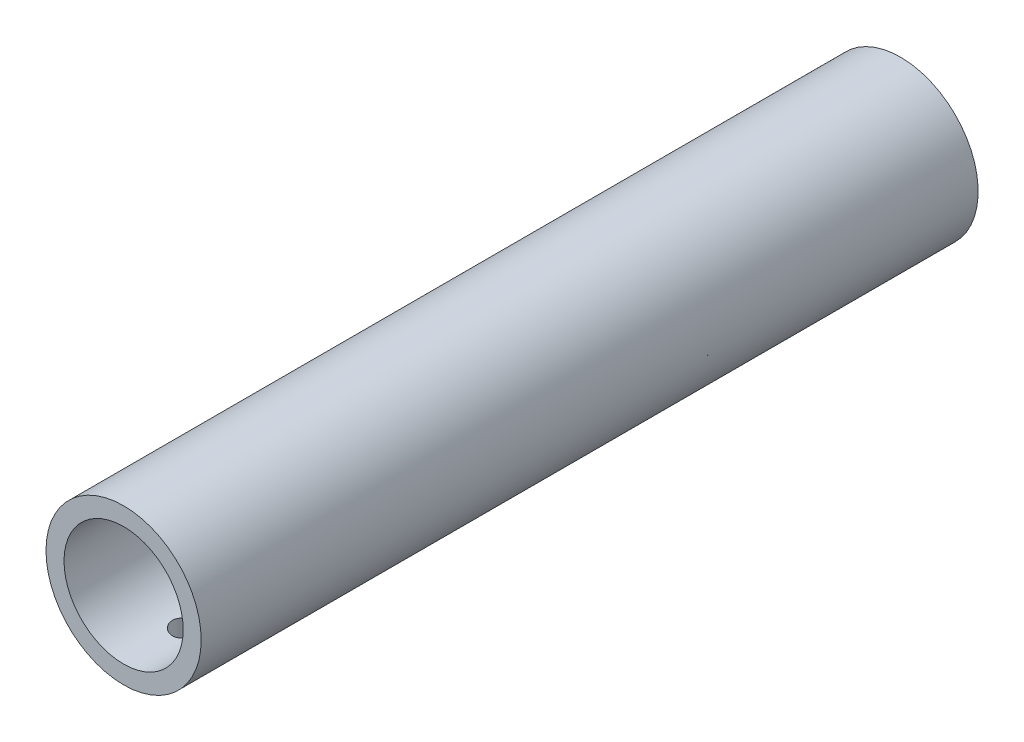
ISO-10303-21;
HEADER;
FILE_DESCRIPTION(('STEP AP214'),'2;1');
FILE_NAME('part.step','',(''),(''),'','','');
FILE_SCHEMA(('AUTOMOTIVE_DESIGN { 1 0 10303 214 1 1 1 1 }'));
ENDSEC;
DATA;
#1=APPLICATION_CONTEXT('core data for automotive mechanical design processes');
#2=APPLICATION_PROTOCOL_DEFINITION('international standard','automotive_design',2000,#1);
#3=PRODUCT_CONTEXT('',#1,'mechanical');
#4=PRODUCT('Part','Part','',(#3));
#5=PRODUCT_RELATED_PRODUCT_CATEGORY('part','',(#4));
#6=PRODUCT_DEFINITION_FORMATION('','',#4);
#7=PRODUCT_DEFINITION_CONTEXT('part definition',#1,'design');
#8=PRODUCT_DEFINITION('design','',#6,#7);
#9=PRODUCT_DEFINITION_SHAPE('','',#8);
#10=(LENGTH_UNIT() NAMED_UNIT(*) SI_UNIT(.MILLI.,.METRE.));
#11=(NAMED_UNIT(*) PLANE_ANGLE_UNIT() SI_UNIT($,.RADIAN.));
#12=(NAMED_UNIT(*) SI_UNIT($,.STERADIAN.) SOLID_ANGLE_UNIT());
#13=UNCERTAINTY_MEASURE_WITH_UNIT(LENGTH_MEASURE(1.E-05),#10,'distance_accuracy_value','');
#14=(GEOMETRIC_REPRESENTATION_CONTEXT(3) GLOBAL_UNCERTAINTY_ASSIGNED_CONTEXT((#13)) GLOBAL_UNIT_ASSIGNED_CONTEXT((#10,
#11,#12)) REPRESENTATION_CONTEXT('',''));
#15=CARTESIAN_POINT('',(0.,0.,0.));
#16=DIRECTION('',(0.,0.,1.));
#17=DIRECTION('',(1.,0.,0.));
#18=AXIS2_PLACEMENT_3D('',#15,#16,#17);
#19=CARTESIAN_POINT('',(0.,0.,123.));
#20=DIRECTION('',(0.,0.,1.));
#21=DIRECTION('',(1.,0.,0.));
#22=AXIS2_PLACEMENT_3D('',#19,#20,#21);
#23=PLANE('',#22);
#24=CARTESIAN_POINT('',(0.,0.,123.));
#25=DIRECTION('',(0.,0.,1.));
#26=DIRECTION('',(1.,0.,0.));
#27=AXIS2_PLACEMENT_3D('',#24,#25,#26);
#28=CIRCLE('',#27,12.7);
#29=CARTESIAN_POINT('',(12.7,0.,123.));
#30=VERTEX_POINT('',#29);
#31=EDGE_CURVE('E10',#30,#30,#28,.T.);
#32=ORIENTED_EDGE('',*,*,#31,.T.);
#33=EDGE_LOOP('',(#32));
#34=FACE_BOUND('',#33,.T.);
#35=CARTESIAN_POINT('',(0.,0.,123.));
#36=DIRECTION('',(0.,0.,1.));
#37=DIRECTION('',(1.,0.,0.));
#38=AXIS2_PLACEMENT_3D('',#35,#36,#37);
#39=CIRCLE('',#38,9.75);
#40=CARTESIAN_POINT('',(9.75,0.,123.));
#41=VERTEX_POINT('',#40);
#42=EDGE_CURVE('E51',#41,#41,#39,.T.);
#43=ORIENTED_EDGE('',*,*,#42,.F.);
#44=EDGE_LOOP('',(#43));
#45=FACE_BOUND('',#44,.T.);
#46=ADVANCED_FACE('F37',(#34,#45),#23,.T.);
#47=CARTESIAN_POINT('',(0.,0.,123.));
#48=DIRECTION('',(0.,0.,-1.));
#49=DIRECTION('',(-1.,0.,0.));
#50=AXIS2_PLACEMENT_3D('',#47,#48,#49);
#51=CYLINDRICAL_SURFACE('',#50,12.7);
#52=CARTESIAN_POINT('',(0.,-12.7,11.67));
#53=CARTESIAN_POINT('',(0.0839420822698033,-12.6999988827326,11.6699964118079));
#54=CARTESIAN_POINT('',(0.167937526372633,-12.6991589575206,11.6629299789214));
#55=CARTESIAN_POINT('',(0.333593673959524,-12.6958891128375,11.6348506887906));
#56=CARTESIAN_POINT('',(0.415251803532516,-12.6934575059403,11.6138230301719));
#57=CARTESIAN_POINT('',(0.573810929266175,-12.6872783957521,11.5584472459305));
#58=CARTESIAN_POINT('',(0.650714992237597,-12.6835317514232,11.5241078138266));
#59=CARTESIAN_POINT('',(0.797653190608794,-12.6751399331166,11.4431016575722));
#60=CARTESIAN_POINT('',(0.867688556898239,-12.6704949205739,11.3964371476658));
#61=CARTESIAN_POINT('',(0.999262502896582,-12.6607998329361,11.2918588032227));
#62=CARTESIAN_POINT('',(1.0607622914766,-12.6557480635198,11.2338963163525));
#63=CARTESIAN_POINT('',(1.17318542931908,-12.6458225910565,11.108471676997));
#64=CARTESIAN_POINT('',(1.22410825495638,-12.6409488968352,11.0410090544735));
#65=CARTESIAN_POINT('',(1.31407455437637,-12.6319145754955,10.8982495509445));
#66=CARTESIAN_POINT('',(1.35308201972531,-12.6277561260851,10.822929827944));
#67=CARTESIAN_POINT('',(1.41788038050309,-12.620645157665,10.6667515960001));
#68=CARTESIAN_POINT('',(1.443671724674,-12.6176925977111,10.5858932752208));
#69=CARTESIAN_POINT('',(1.48118860737724,-12.6133436872066,10.4213339684397));
#70=CARTESIAN_POINT('',(1.49297935194811,-12.6119401245711,10.3376480422524));
#71=CARTESIAN_POINT('',(1.50236204916732,-12.610825978807,10.1694743404447));
#72=CARTESIAN_POINT('',(1.49995451372525,-12.6111153346415,10.0849865938431));
#73=CARTESIAN_POINT('',(1.4810625807461,-12.6133477341969,9.91806050029005));
#74=CARTESIAN_POINT('',(1.46464982095266,-12.6152823620618,9.83561391721182));
#75=CARTESIAN_POINT('',(1.4183250189296,-12.6205741933103,9.67465355201679));
#76=CARTESIAN_POINT('',(1.38841273009105,-12.6239314226819,9.59613984177468));
#77=CARTESIAN_POINT('',(1.31586035539079,-12.6316997722425,9.44505027097354));
#78=CARTESIAN_POINT('',(1.27318894526893,-12.6361134807569,9.37248959065306));
#79=CARTESIAN_POINT('',(1.17635204930392,-12.6454954261345,9.23553208501469));
#80=CARTESIAN_POINT('',(1.12218609389625,-12.6504636856478,9.17113559338439));
#81=CARTESIAN_POINT('',(1.00349973978308,-12.6604323823877,9.05191849342974));
#82=CARTESIAN_POINT('',(0.938917556921265,-12.665432829137,8.99715937621297));
#83=CARTESIAN_POINT('',(0.801445264407195,-12.6748737446425,8.89924956754659));
#84=CARTESIAN_POINT('',(0.728555138926123,-12.6793142123318,8.85609889821466));
#85=CARTESIAN_POINT('',(0.576490055716571,-12.6871371957094,8.78263157797207));
#86=CARTESIAN_POINT('',(0.497313326513339,-12.6905194118617,8.75231855987736));
#87=CARTESIAN_POINT('',(0.33494493091353,-12.6958420090734,8.70543471352162));
#88=CARTESIAN_POINT('',(0.25175343237968,-12.6977824503599,8.68886331123161));
#89=CARTESIAN_POINT('',(0.0842489261370051,-12.6999950642394,8.67001229226661));
#90=CARTESIAN_POINT('',(-5.44183282695634E-05,-12.7002771294264,8.66764792549933));
#91=CARTESIAN_POINT('',(-0.167856134709772,-12.6991678654194,8.67705475266653));
#92=CARTESIAN_POINT('',(-0.251354521862891,-12.6977765679632,8.68882567850492));
#93=CARTESIAN_POINT('',(-0.414927663759731,-12.6934831109266,8.72609857778214));
#94=CARTESIAN_POINT('',(-0.495011703322698,-12.6905853747988,8.75156035735807));
#95=CARTESIAN_POINT('',(-0.649772779139555,-12.6836036465378,8.81545055345534));
#96=CARTESIAN_POINT('',(-0.724449649826472,-12.6795196180996,8.8538793668222));
#97=CARTESIAN_POINT('',(-0.866656484256891,-12.670596386457,8.94281934936634));
#98=CARTESIAN_POINT('',(-0.934151783255444,-12.665753776747,8.99338559674681));
#99=CARTESIAN_POINT('',(-1.05972738087444,-12.6558663507853,9.1050868261572));
#100=CARTESIAN_POINT('',(-1.11780734700529,-12.6508215274005,9.16622218126324));
#101=CARTESIAN_POINT('',(-1.22320239167113,-12.641067954347,9.29769850805255));
#102=CARTESIAN_POINT('',(-1.27046145406194,-12.6363610363807,9.36808453931015));
#103=CARTESIAN_POINT('',(-1.35248676734065,-12.6278457122097,9.51584450505072));
#104=CARTESIAN_POINT('',(-1.38725324570836,-12.6240372896446,9.59321831225987));
#105=CARTESIAN_POINT('',(-1.44321488575905,-12.6177623715242,9.75257336027111));
#106=CARTESIAN_POINT('',(-1.4644421475615,-12.61529270402,9.83454319810087));
#107=CARTESIAN_POINT('',(-1.49282640973576,-12.6119656229193,10.0009147520418));
#108=CARTESIAN_POINT('',(-1.49998398914529,-12.6111081429733,10.0853163679282));
#109=CARTESIAN_POINT('',(-1.50001585914835,-12.6111043079037,10.25359852436));
#110=CARTESIAN_POINT('',(-1.49297814622881,-12.6119474108824,10.3374790616829));
#111=CARTESIAN_POINT('',(-1.46500500266682,-12.6152271376562,10.5028565165549));
#112=CARTESIAN_POINT('',(-1.44406956580856,-12.617663762164,10.584353433038));
#113=CARTESIAN_POINT('',(-1.38892183685995,-12.623852826893,10.74264186215));
#114=CARTESIAN_POINT('',(-1.3547133021794,-12.6276048947035,10.8194346993143));
#115=CARTESIAN_POINT('',(-1.2739991507101,-12.6360027425766,10.9662038585663));
#116=CARTESIAN_POINT('',(-1.22749344545379,-12.6406485290687,11.0361801316097));
#117=CARTESIAN_POINT('',(-1.12317720243418,-12.6503448778814,11.1677801027458));
#118=CARTESIAN_POINT('',(-1.06530103818042,-12.6553976844433,11.2293516178608));
#119=CARTESIAN_POINT('',(-0.940022344914655,-12.6653186981027,11.3419435506859));
#120=CARTESIAN_POINT('',(-0.872617563286807,-12.6701868612035,11.3929614664234));
#121=CARTESIAN_POINT('',(-0.729934131839872,-12.6792081630774,11.4831434532727));
#122=CARTESIAN_POINT('',(-0.654629414897906,-12.6833588069069,11.5222665078512));
#123=CARTESIAN_POINT('',(-0.498513897993464,-12.6904517180572,11.5872570116837));
#124=CARTESIAN_POINT('',(-0.417709259502452,-12.6933953124582,11.6131390264847));
#125=CARTESIAN_POINT('',(-0.280395336213662,-12.6970238791236,11.6446400398486));
#126=CARTESIAN_POINT('',(-0.224755734007028,-12.6981345571862,11.6541365602843));
#127=CARTESIAN_POINT('',(-0.112752111284235,-12.6996229905676,11.6668177255724));
#128=CARTESIAN_POINT('',(-0.0563880953546786,-12.7000007505244,11.6700024103681));
#129=CARTESIAN_POINT('',(0.,-12.7,11.67));
#130=B_SPLINE_CURVE_WITH_KNOTS('',3,(#52,#53,#54,#55,#56,#57,#58,#59,#60,#61,#62,#63,#64,#65,
#66,#67,#68,#69,#70,#71,#72,#73,#74,#75,#76,#77,#78,#79,#80,#81,#82,#83,#84,#85,#86,#87,#88,#89,
#90,#91,#92,#93,#94,#95,#96,#97,#98,#99,#100,#101,#102,#103,#104,#105,#106,#107,#108,#109,#110,
#111,#112,#113,#114,#115,#116,#117,#118,#119,#120,#121,#122,#123,#124,#125,#126,#127,#128,#129),
.UNSPECIFIED.,.T.,.F.,(4,2,2,2,2,2,2,2,2,2,2,2,2,2,2,2,2,2,2,2,2,2,2,2,2,2,2,2,2,2,2,2,2,2,2,2,
2,2,4),(0.,0.251620297093687,0.503507783181608,0.755231045508929,1.00690911558113,
1.25969593293064,1.51249526181211,1.76605116440293,2.01959845714969,2.27196019469523,
2.52431283356079,2.77538235504053,3.02645646323515,3.27815210347085,3.5298580277237,
3.78311591937164,4.03637429355051,4.28970428731715,4.54302369818859,4.79483045513734,
5.04663243628533,5.29769917680962,5.54877360172442,5.80100965958408,6.05325462287553,
6.30677725116391,6.56029526277725,6.81320995226124,7.06611423282419,7.31745558048385,
7.56879704055696,7.82006740157954,8.07133957032556,8.3241070224449,8.57693433037654,
8.83062381427528,9.08403362870476,9.25306063770611,9.42208657704471),.UNSPECIFIED.);
#131=CARTESIAN_POINT('',(0.,-12.7,11.67));
#132=VERTEX_POINT('',#131);
#133=EDGE_CURVE('E56',#132,#132,#130,.T.);
#134=ORIENTED_EDGE('',*,*,#133,.T.);
#135=EDGE_LOOP('',(#134));
#136=FACE_BOUND('',#135,.T.);
#137=CARTESIAN_POINT('',(0.,-12.7,30.5));
#138=CARTESIAN_POINT('',(0.0839420822698035,-12.6999988827326,30.4999964118079));
#139=CARTESIAN_POINT('',(0.167937526372634,-12.6991589575206,30.4929299789214));
#140=CARTESIAN_POINT('',(0.333593673959525,-12.6958891128375,30.4648506887906));
#141=CARTESIAN_POINT('',(0.415251803532516,-12.6934575059403,30.4438230301719));
#142=CARTESIAN_POINT('',(0.573810929266176,-12.6872783957521,30.3884472459305));
#143=CARTESIAN_POINT('',(0.650714992237598,-12.6835317514232,30.3541078138266));
#144=CARTESIAN_POINT('',(0.797653190608795,-12.6751399331166,30.2731016575722));
#145=CARTESIAN_POINT('',(0.86768855689824,-12.6704949205739,30.2264371476658));
#146=CARTESIAN_POINT('',(0.999262502896583,-12.6607998329361,30.1218588032227));
#147=CARTESIAN_POINT('',(1.0607622914766,-12.6557480635198,30.0638963163525));
#148=CARTESIAN_POINT('',(1.17318542931908,-12.6458225910565,29.938471676997));
#149=CARTESIAN_POINT('',(1.22410825495638,-12.6409488968352,29.8710090544735));
#150=CARTESIAN_POINT('',(1.31407455437637,-12.6319145754955,29.7282495509445));
#151=CARTESIAN_POINT('',(1.35308201972531,-12.6277561260851,29.652929827944));
#152=CARTESIAN_POINT('',(1.41788038050309,-12.620645157665,29.4967515960001));
#153=CARTESIAN_POINT('',(1.443671724674,-12.6176925977111,29.4158932752208));
#154=CARTESIAN_POINT('',(1.48118860737724,-12.6133436872066,29.2513339684397));
#155=CARTESIAN_POINT('',(1.49297935194811,-12.6119401245711,29.1676480422524));
#156=CARTESIAN_POINT('',(1.50236204916732,-12.610825978807,28.9994743404447));
#157=CARTESIAN_POINT('',(1.49995451372525,-12.6111153346415,28.9149865938431));
#158=CARTESIAN_POINT('',(1.48106258074611,-12.6133477341969,28.7480605002901));
#159=CARTESIAN_POINT('',(1.46464982095267,-12.6152823620618,28.6656139172118));
#160=CARTESIAN_POINT('',(1.4183250189296,-12.6205741933103,28.5046535520168));
#161=CARTESIAN_POINT('',(1.38841273009105,-12.6239314226819,28.4261398417747));
#162=CARTESIAN_POINT('',(1.31586035539079,-12.6316997722425,28.2750502709735));
#163=CARTESIAN_POINT('',(1.27318894526893,-12.6361134807569,28.2024895906531));
#164=CARTESIAN_POINT('',(1.17635204930392,-12.6454954261345,28.0655320850147));
#165=CARTESIAN_POINT('',(1.12218609389626,-12.6504636856478,28.0011355933844));
#166=CARTESIAN_POINT('',(1.00349973978308,-12.6604323823877,27.8819184934297));
#167=CARTESIAN_POINT('',(0.938917556921269,-12.665432829137,27.827159376213));
#168=CARTESIAN_POINT('',(0.801445264407197,-12.6748737446425,27.7292495675466));
#169=CARTESIAN_POINT('',(0.728555138926124,-12.6793142123318,27.6860988982147));
#170=CARTESIAN_POINT('',(0.57649005571657,-12.6871371957094,27.6126315779721));
#171=CARTESIAN_POINT('',(0.497313326513339,-12.6905194118617,27.5823185598774));
#172=CARTESIAN_POINT('',(0.33494493091353,-12.6958420090734,27.5354347135216));
#173=CARTESIAN_POINT('',(0.251753432379681,-12.6977824503599,27.5188633112316));
#174=CARTESIAN_POINT('',(0.0842489261370061,-12.6999950642394,27.5000122922666));
#175=CARTESIAN_POINT('',(-5.44183282687503E-05,-12.7002771294264,27.4976479254993));
#176=CARTESIAN_POINT('',(-0.167856134709771,-12.6991678654194,27.5070547526665));
#177=CARTESIAN_POINT('',(-0.251354521862891,-12.6977765679632,27.5188256785049));
#178=CARTESIAN_POINT('',(-0.414927663759731,-12.6934831109266,27.5560985777821));
#179=CARTESIAN_POINT('',(-0.495011703322699,-12.6905853747988,27.5815603573581));
#180=CARTESIAN_POINT('',(-0.649772779139556,-12.6836036465378,27.6454505534553));
#181=CARTESIAN_POINT('',(-0.724449649826472,-12.6795196180996,27.6838793668222));
#182=CARTESIAN_POINT('',(-0.866656484256892,-12.670596386457,27.7728193493663));
#183=CARTESIAN_POINT('',(-0.934151783255445,-12.665753776747,27.8233855967468));
#184=CARTESIAN_POINT('',(-1.05972738087444,-12.6558663507853,27.9350868261572));
#185=CARTESIAN_POINT('',(-1.11780734700529,-12.6508215274005,27.9962221812632));
#186=CARTESIAN_POINT('',(-1.22320239167113,-12.641067954347,28.1276985080525));
#187=CARTESIAN_POINT('',(-1.27046145406194,-12.6363610363807,28.1980845393101));
#188=CARTESIAN_POINT('',(-1.35248676734065,-12.6278457122097,28.3458445050507));
#189=CARTESIAN_POINT('',(-1.38725324570836,-12.6240372896446,28.4232183122599));
#190=CARTESIAN_POINT('',(-1.44321488575905,-12.6177623715242,28.5825733602711));
#191=CARTESIAN_POINT('',(-1.4644421475615,-12.61529270402,28.6645431981009));
#192=CARTESIAN_POINT('',(-1.49282640973576,-12.6119656229193,28.8309147520418));
#193=CARTESIAN_POINT('',(-1.4999839891453,-12.6111081429733,28.9153163679282));
#194=CARTESIAN_POINT('',(-1.50001585914836,-12.6111043079037,29.08359852436));
#195=CARTESIAN_POINT('',(-1.49297814622881,-12.6119474108824,29.1674790616829));
#196=CARTESIAN_POINT('',(-1.46500500266682,-12.6152271376562,29.3328565165549));
#197=CARTESIAN_POINT('',(-1.44406956580856,-12.617663762164,29.414353433038));
#198=CARTESIAN_POINT('',(-1.38892183685995,-12.623852826893,29.57264186215));
#199=CARTESIAN_POINT('',(-1.3547133021794,-12.6276048947035,29.6494346993143));
#200=CARTESIAN_POINT('',(-1.27399915071011,-12.6360027425766,29.7962038585663));
#201=CARTESIAN_POINT('',(-1.22749344545379,-12.6406485290687,29.8661801316097));
#202=CARTESIAN_POINT('',(-1.12317720243418,-12.6503448778814,29.9977801027458));
#203=CARTESIAN_POINT('',(-1.06530103818042,-12.6553976844433,30.0593516178608));
#204=CARTESIAN_POINT('',(-0.940022344914657,-12.6653186981027,30.1719435506859));
#205=CARTESIAN_POINT('',(-0.872617563286808,-12.6701868612035,30.2229614664234));
#206=CARTESIAN_POINT('',(-0.729934131839873,-12.6792081630774,30.3131434532727));
#207=CARTESIAN_POINT('',(-0.654629414897906,-12.6833588069069,30.3522665078512));
#208=CARTESIAN_POINT('',(-0.498513897993465,-12.6904517180572,30.4172570116837));
#209=CARTESIAN_POINT('',(-0.417709259502453,-12.6933953124582,30.4431390264847));
#210=CARTESIAN_POINT('',(-0.280395336213663,-12.6970238791236,30.4746400398486));
#211=CARTESIAN_POINT('',(-0.224755734007029,-12.6981345571862,30.4841365602843));
#212=CARTESIAN_POINT('',(-0.112752111284234,-12.6996229905676,30.4968177255724));
#213=CARTESIAN_POINT('',(-0.0563880953546785,-12.7000007505244,30.5000024103681));
#214=CARTESIAN_POINT('',(0.,-12.7,30.5));
#215=B_SPLINE_CURVE_WITH_KNOTS('',3,(#137,#138,#139,#140,#141,#142,#143,#144,#145,#146,#147,
#148,#149,#150,#151,#152,#153,#154,#155,#156,#157,#158,#159,#160,#161,#162,#163,#164,#165,#166,
#167,#168,#169,#170,#171,#172,#173,#174,#175,#176,#177,#178,#179,#180,#181,#182,#183,#184,#185,
#186,#187,#188,#189,#190,#191,#192,#193,#194,#195,#196,#197,#198,#199,#200,#201,#202,#203,#204,
#205,#206,#207,#208,#209,#210,#211,#212,#213,#214),.UNSPECIFIED.,.T.,.F.,(4,2,2,2,2,2,2,2,2,2,2,
2,2,2,2,2,2,2,2,2,2,2,2,2,2,2,2,2,2,2,2,2,2,2,2,2,2,2,4),(0.,0.251620297093688,
0.503507783181608,0.75523104550893,1.00690911558114,1.25969593293064,1.5124952618121,
1.76605116440293,2.01959845714969,2.27196019469524,2.52431283356079,2.77538235504053,
3.02645646323516,3.27815210347086,3.5298580277237,3.78311591937164,4.03637429355051,
4.28970428731715,4.5430236981886,4.79483045513734,5.04663243628533,5.29769917680963,
5.54877360172442,5.80100965958408,6.05325462287553,6.30677725116392,6.56029526277726,
6.81320995226125,7.0661142328242,7.31745558048386,7.56879704055697,7.82006740157955,
8.07133957032556,8.32410702244491,8.57693433037655,8.83062381427529,9.08403362870477,
9.25306063770612,9.42208657704472),.UNSPECIFIED.);
#216=CARTESIAN_POINT('',(0.,-12.7,30.5));
#217=VERTEX_POINT('',#216);
#218=EDGE_CURVE('E90',#217,#217,#215,.T.);
#219=ORIENTED_EDGE('',*,*,#218,.T.);
#220=EDGE_LOOP('',(#219));
#221=FACE_BOUND('',#220,.T.);
#222=CARTESIAN_POINT('',(0.,-12.7,115.));
#223=CARTESIAN_POINT('',(0.111600664148433,-12.6999981524228,114.999995451042));
#224=CARTESIAN_POINT('',(0.223264408691947,-12.6985135958241,114.990627424683));
#225=CARTESIAN_POINT('',(0.443466081735367,-12.6927343158842,114.953414979655));
#226=CARTESIAN_POINT('',(0.552000938104324,-12.688436922686,114.925553006754));
#227=CARTESIAN_POINT('',(0.762726600203348,-12.6775144984945,114.852209758849));
#228=CARTESIAN_POINT('',(0.864922301127032,-12.6708912905376,114.80674228066));
#229=CARTESIAN_POINT('',(1.06021942005789,-12.6560475167909,114.699513464829));
#230=CARTESIAN_POINT('',(1.15332200133803,-12.6478271557265,114.637754215127));
#231=CARTESIAN_POINT('',(1.32860297056713,-12.6306231344999,114.499131047503));
#232=CARTESIAN_POINT('',(1.4106920672292,-12.6216341021079,114.422154880663));
#233=CARTESIAN_POINT('',(1.56084506439829,-12.6039474984593,114.255524539183));
#234=CARTESIAN_POINT('',(1.6289081247398,-12.5952499446885,114.16586960562));
#235=CARTESIAN_POINT('',(1.74942910866079,-12.5790789996388,113.975820824021));
#236=CARTESIAN_POINT('',(1.80179980015071,-12.5716125514922,113.87537101488));
#237=CARTESIAN_POINT('',(1.88889181156734,-12.5588230882536,113.666963393551));
#238=CARTESIAN_POINT('',(1.9236141931795,-12.5534999442289,113.559006033445));
#239=CARTESIAN_POINT('',(1.97414485466215,-12.5456529167489,113.339590246175));
#240=CARTESIAN_POINT('',(1.99010658054077,-12.5431063360034,113.228167983852));
#241=CARTESIAN_POINT('',(2.00313837228686,-12.5410319744817,113.004199713798));
#242=CARTESIAN_POINT('',(2.00020963248389,-12.5415040028571,112.891653777559));
#243=CARTESIAN_POINT('',(1.97566884734412,-12.5453927846462,112.669721848093));
#244=CARTESIAN_POINT('',(1.9542283431422,-12.5487825001334,112.560316343868));
#245=CARTESIAN_POINT('',(1.89354147195399,-12.5580824469318,112.346675216041));
#246=CARTESIAN_POINT('',(1.85429455435304,-12.563992756185,112.242439752419));
#247=CARTESIAN_POINT('',(1.75893248532883,-12.5776975271031,112.04157930505));
#248=CARTESIAN_POINT('',(1.70274529763056,-12.5855000066881,111.944989091316));
#249=CARTESIAN_POINT('',(1.57514886920774,-12.6021042826765,111.762542843197));
#250=CARTESIAN_POINT('',(1.50373852907516,-12.6109061512339,111.676687584796));
#251=CARTESIAN_POINT('',(1.34678429864889,-12.6286366346194,111.517154705019));
#252=CARTESIAN_POINT('',(1.2610930547786,-12.6375655758177,111.443622014474));
#253=CARTESIAN_POINT('',(1.07851000708309,-12.6544540651169,111.311958543942));
#254=CARTESIAN_POINT('',(0.981618144707529,-12.6624136081499,111.253827844474));
#255=CARTESIAN_POINT('',(0.779253998051946,-12.6764760534843,111.154608526518));
#256=CARTESIAN_POINT('',(0.673775789064685,-12.6825776597812,111.113531796808));
#257=CARTESIAN_POINT('',(0.457300496976723,-12.6922261116509,111.049716134647));
#258=CARTESIAN_POINT('',(0.346303826181979,-12.6957731477799,111.026975834388));
#259=CARTESIAN_POINT('',(0.123192515262887,-12.6998873989399,111.000672899492));
#260=CARTESIAN_POINT('',(0.011101900010242,-12.7004855521301,110.996911141954));
#261=CARTESIAN_POINT('',(-0.212108799245069,-12.6987190855452,111.008142522172));
#262=CARTESIAN_POINT('',(-0.3232289163319,-12.6963545671673,111.023135018065));
#263=CARTESIAN_POINT('',(-0.540735984090577,-12.6889475760288,111.071283720174));
#264=CARTESIAN_POINT('',(-0.647145094524482,-12.6839195116251,111.104342229076));
#265=CARTESIAN_POINT('',(-0.852910537175747,-12.6717471746444,111.18758103197));
#266=CARTESIAN_POINT('',(-0.952266509022144,-12.6646027940332,111.237762200061));
#267=CARTESIAN_POINT('',(-1.14197626986114,-12.6489143053637,111.354284166928));
#268=CARTESIAN_POINT('',(-1.23225209209936,-12.64035950645,111.420750437159));
#269=CARTESIAN_POINT('',(-1.40043925638693,-12.6228338045793,111.567782102648));
#270=CARTESIAN_POINT('',(-1.47834980144402,-12.6138628748489,111.648348406007));
#271=CARTESIAN_POINT('',(-1.62032529447353,-12.5964170389827,111.822182542905));
#272=CARTESIAN_POINT('',(-1.68425629390625,-12.5879474544687,111.915560392812));
#273=CARTESIAN_POINT('',(-1.79552493875652,-12.5725597460065,112.111846751863));
#274=CARTESIAN_POINT('',(-1.84286306759369,-12.5656415768612,112.214754983236));
#275=CARTESIAN_POINT('',(-1.91939776922028,-12.5541791497608,112.426792371463));
#276=CARTESIAN_POINT('',(-1.94866316332215,-12.5496258968279,112.535896179395));
#277=CARTESIAN_POINT('',(-1.98843966512351,-12.5433855077099,112.757547864879));
#278=CARTESIAN_POINT('',(-1.99895221290397,-12.5416981514454,112.870095477298));
#279=CARTESIAN_POINT('',(-2.00088776475511,-12.5413893815232,113.094103819439));
#280=CARTESIAN_POINT('',(-1.99252147376704,-12.5427341267358,113.205562738609));
#281=CARTESIAN_POINT('',(-1.95739014761225,-12.5482642234243,113.425466724489));
#282=CARTESIAN_POINT('',(-1.93062515445397,-12.5524495684144,113.533911798081));
#283=CARTESIAN_POINT('',(-1.8595334344723,-12.5631769993357,113.744641242988));
#284=CARTESIAN_POINT('',(-1.81522293072758,-12.569716907665,113.846931205129));
#285=CARTESIAN_POINT('',(-1.71031923483932,-12.5844189839644,114.042659342833));
#286=CARTESIAN_POINT('',(-1.6497253785591,-12.5925812180996,114.13609715714));
#287=CARTESIAN_POINT('',(-1.51321535288378,-12.609716418747,114.312536607581));
#288=CARTESIAN_POINT('',(-1.4371435662029,-12.6186970623269,114.395417113511));
#289=CARTESIAN_POINT('',(-1.27216585168971,-12.6363943544853,114.547309934355));
#290=CARTESIAN_POINT('',(-1.18325695526794,-12.645110941435,114.616319032643));
#291=CARTESIAN_POINT('',(-0.994487066672445,-12.6613592038177,114.738890570925));
#292=CARTESIAN_POINT('',(-0.894562527845783,-12.6688833207732,114.792356140606));
#293=CARTESIAN_POINT('',(-0.687076932420269,-12.6818250857032,114.881663001682));
#294=CARTESIAN_POINT('',(-0.579523781530762,-12.6872448777818,114.917522242139));
#295=CARTESIAN_POINT('',(-0.392929714532188,-12.6941538178297,114.962616249847));
#296=CARTESIAN_POINT('',(-0.315030916138595,-12.6963346778751,114.976613287398));
#297=CARTESIAN_POINT('',(-0.158098621405052,-12.699258413071,114.99530670685));
#298=CARTESIAN_POINT('',(-0.0790651414330059,-12.7000013089434,115.000003222777));
#299=CARTESIAN_POINT('',(0.,-12.7,115.));
#300=B_SPLINE_CURVE_WITH_KNOTS('',3,(#222,#223,#224,#225,#226,#227,#228,#229,#230,#231,#232,
#233,#234,#235,#236,#237,#238,#239,#240,#241,#242,#243,#244,#245,#246,#247,#248,#249,#250,#251,
#252,#253,#254,#255,#256,#257,#258,#259,#260,#261,#262,#263,#264,#265,#266,#267,#268,#269,#270,
#271,#272,#273,#274,#275,#276,#277,#278,#279,#280,#281,#282,#283,#284,#285,#286,#287,#288,#289,
#290,#291,#292,#293,#294,#295,#296,#297,#298,#299),.UNSPECIFIED.,.T.,.F.,(4,2,2,2,2,2,2,2,2,2,2,
2,2,2,2,2,2,2,2,2,2,2,2,2,2,2,2,2,2,2,2,2,2,2,2,2,2,2,4),(0.,0.334513039604498,0.66934404990315,
1.00391319427768,1.33843948136658,1.67553227840723,2.0126452615833,2.35159886049296,
2.69053206624815,3.02667336088653,3.36279340355812,3.69583178246364,4.02888046037269,
4.36336585230726,4.69787540878864,5.03607855788056,5.37428347498269,5.71272376947475,
6.0511388156515,6.3859957165806,6.72084115736919,7.05389348767036,7.38696282261845,
7.72268383084117,8.05842646886414,8.39725738316849,8.7360784250927,9.07360114302582,
9.41109794057522,9.74484662182496,10.0785945410525,10.4120345853634,10.7454882315036,
11.082476702277,11.419543227025,11.758667468913,12.0974452634267,12.3344393900489,
12.5714301014333),.UNSPECIFIED.);
#301=CARTESIAN_POINT('',(0.,-12.7,115.));
#302=VERTEX_POINT('',#301);
#303=EDGE_CURVE('E66',#302,#302,#300,.T.);
#304=ORIENTED_EDGE('',*,*,#303,.T.);
#305=EDGE_LOOP('',(#304));
#306=FACE_BOUND('',#305,.T.);
#307=ORIENTED_EDGE('',*,*,#31,.F.);
#308=EDGE_LOOP('',(#307));
#309=FACE_BOUND('',#308,.T.);
#310=CARTESIAN_POINT('',(0.,0.,-4.17));
#311=DIRECTION('',(0.,0.,-1.));
#312=DIRECTION('',(-1.,0.,0.));
#313=AXIS2_PLACEMENT_3D('',#310,#311,#312);
#314=CIRCLE('',#313,12.7);
#315=CARTESIAN_POINT('',(-12.7,0.,-4.17));
#316=VERTEX_POINT('',#315);
#317=EDGE_CURVE('E67',#316,#316,#314,.T.);
#318=ORIENTED_EDGE('',*,*,#317,.F.);
#319=EDGE_LOOP('',(#318));
#320=FACE_BOUND('',#319,.T.);
#321=ADVANCED_FACE('F39',(#136,#221,#306,#309,#320),#51,.T.);
#322=CARTESIAN_POINT('',(0.,0.,123.));
#323=DIRECTION('',(0.,0.,-1.));
#324=DIRECTION('',(-1.,0.,0.));
#325=AXIS2_PLACEMENT_3D('',#322,#323,#324);
#326=CYLINDRICAL_SURFACE('',#325,9.75);
#327=CARTESIAN_POINT('',(0.,-9.75,11.67));
#328=CARTESIAN_POINT('',(0.083725597094829,-9.7499986348825,11.6699965672525));
#329=CARTESIAN_POINT('',(0.16749913719684,-9.74891025514911,11.6629663555253));
#330=CARTESIAN_POINT('',(0.332702849736005,-9.74467325345894,11.6350393902176));
#331=CARTESIAN_POINT('',(0.414130689920022,-9.74152265022295,11.6141293012858));
#332=CARTESIAN_POINT('',(0.57222841632527,-9.73351510877682,11.5590836664987));
#333=CARTESIAN_POINT('',(0.648901912071875,-9.72865948416261,11.5249582999855));
#334=CARTESIAN_POINT('',(0.795423127906568,-9.71777785476948,11.4444760837864));
#335=CARTESIAN_POINT('',(0.865271756957841,-9.71175200616593,11.3981208659725));
#336=CARTESIAN_POINT('',(0.996744579018559,-9.69914430233968,11.2940899097175));
#337=CARTESIAN_POINT('',(1.05830469109658,-9.69255869318027,11.2363336330893));
#338=CARTESIAN_POINT('',(1.17089998678124,-9.67960294435345,11.1113133737787));
#339=CARTESIAN_POINT('',(1.22193455236823,-9.67323281735669,11.0440488331983));
#340=CARTESIAN_POINT('',(1.31228118175537,-9.66139287721394,10.9014887079106));
#341=CARTESIAN_POINT('',(1.35153093772537,-9.65592791564851,10.8261531980512));
#342=CARTESIAN_POINT('',(1.41679554994362,-9.64656851529946,10.669860840701));
#343=CARTESIAN_POINT('',(1.44281116544679,-9.64267398642131,10.588904315996));
#344=CARTESIAN_POINT('',(1.48066934349271,-9.63693341822236,10.4243431567841));
#345=CARTESIAN_POINT('',(1.49262182606832,-9.6350715000295,10.3407643740861));
#346=CARTESIAN_POINT('',(1.50235503698613,-9.63355879918595,10.1727683025715));
#347=CARTESIAN_POINT('',(1.50013662076864,-9.63390788306592,10.0883510646761));
#348=CARTESIAN_POINT('',(1.48168076971774,-9.63676322899689,9.9218526722524));
#349=CARTESIAN_POINT('',(1.46556599166247,-9.63925061663173,9.8397575511676));
#350=CARTESIAN_POINT('',(1.41996697045862,-9.64607280652549,9.67945043830169));
#351=CARTESIAN_POINT('',(1.39048233116554,-9.65040766352407,9.60123856165599));
#352=CARTESIAN_POINT('',(1.31885369262605,-9.66045710938216,9.45054622672421));
#353=CARTESIAN_POINT('',(1.27665796620735,-9.66617731685081,9.37809074599129));
#354=CARTESIAN_POINT('',(1.18084174856116,-9.67834891554285,9.24124218799841));
#355=CARTESIAN_POINT('',(1.12722046918666,-9.6848003571932,9.17684966741694));
#356=CARTESIAN_POINT('',(1.00940308058212,-9.69779080134088,9.05724421706801));
#357=CARTESIAN_POINT('',(0.945101562936528,-9.704330010507,9.00213508944458));
#358=CARTESIAN_POINT('',(0.808107626798423,-9.71669616062019,8.90347432212673));
#359=CARTESIAN_POINT('',(0.735415168027883,-9.72252309814795,8.85992273791391));
#360=CARTESIAN_POINT('',(0.583611156916406,-9.73281471818099,8.78560708110687));
#361=CARTESIAN_POINT('',(0.504495494447524,-9.73727851959584,8.7548512746868));
#362=CARTESIAN_POINT('',(0.342138061268065,-9.7443336217095,8.70709180744229));
#363=CARTESIAN_POINT('',(0.258896584584566,-9.74692505563855,8.69008716812905));
#364=CARTESIAN_POINT('',(0.0915460602422245,-9.74992573320674,8.67045135886558));
#365=CARTESIAN_POINT('',(0.00745412561123924,-9.75035663466449,8.66767752850055));
#366=CARTESIAN_POINT('',(-0.159993794019548,-9.74904673183848,8.67620303970317));
#367=CARTESIAN_POINT('',(-0.243349802933035,-9.74730599838487,8.68750192227457));
#368=CARTESIAN_POINT('',(-0.406525686372383,-9.74186181283924,8.72373348795666));
#369=CARTESIAN_POINT('',(-0.48636141279672,-9.73816840534847,8.74859641797468));
#370=CARTESIAN_POINT('',(-0.640731215954756,-9.72923158047685,8.81117657577161));
#371=CARTESIAN_POINT('',(-0.715265032392349,-9.72398808705995,8.84889443413467));
#372=CARTESIAN_POINT('',(-0.85754089436358,-9.71247974824997,8.93644670008984));
#373=CARTESIAN_POINT('',(-0.925226823744648,-9.70620742044751,8.98637129681634));
#374=CARTESIAN_POINT('',(-1.05131054638893,-9.69336216313701,9.09679463206431));
#375=CARTESIAN_POINT('',(-1.10970776980821,-9.68678921521833,9.15729401885094));
#376=CARTESIAN_POINT('',(-1.21607765382797,-9.67401455215288,9.287785748212));
#377=CARTESIAN_POINT('',(-1.26395451190598,-9.66781659348622,9.35785660804056));
#378=CARTESIAN_POINT('',(-1.34725800281441,-9.65656099571451,9.50512978233869));
#379=CARTESIAN_POINT('',(-1.38268498558581,-9.6515033245597,9.58233189628599));
#380=CARTESIAN_POINT('',(-1.43993574915646,-9.64312836811527,9.74139437623854));
#381=CARTESIAN_POINT('',(-1.46180933836865,-9.63980471754412,9.82323646488115));
#382=CARTESIAN_POINT('',(-1.49149055433532,-9.63525740324653,9.98948775915239));
#383=CARTESIAN_POINT('',(-1.49929920752474,-9.63403358627814,10.0738967769937));
#384=CARTESIAN_POINT('',(-1.50060353592778,-9.63383042474114,10.2419306026841));
#385=CARTESIAN_POINT('',(-1.49424987819352,-9.63482745342316,10.3255542512513));
#386=CARTESIAN_POINT('',(-1.4677334610574,-9.63890219891737,10.4905284075406));
#387=CARTESIAN_POINT('',(-1.44757072847217,-9.64197991168895,10.5718789196766));
#388=CARTESIAN_POINT('',(-1.39406278656465,-9.64986082413317,10.7299521309282));
#389=CARTESIAN_POINT('',(-1.36072865276843,-9.6546625737941,10.8066786559343));
#390=CARTESIAN_POINT('',(-1.28183922882435,-9.66545220330251,10.9534745017358));
#391=CARTESIAN_POINT('',(-1.23628348168486,-9.67144012750134,11.0235435734625));
#392=CARTESIAN_POINT('',(-1.13369872530266,-9.68400314974483,11.1558000728581));
#393=CARTESIAN_POINT('',(-1.07655828443068,-9.69058357619951,11.2179005729765));
#394=CARTESIAN_POINT('',(-0.952661636989767,-9.70354611571483,11.331684571472));
#395=CARTESIAN_POINT('',(-0.885903202579084,-9.70992818241133,11.3833656496972));
#396=CARTESIAN_POINT('',(-0.74420829172262,-9.72181740658485,11.4751134105839));
#397=CARTESIAN_POINT('',(-0.66922657465207,-9.72731926800759,11.5151109025443));
#398=CARTESIAN_POINT('',(-0.513558845114154,-9.73677636223739,11.5818835975713));
#399=CARTESIAN_POINT('',(-0.432878788430058,-9.7407331824475,11.6086723789807));
#400=CARTESIAN_POINT('',(-0.293206050051814,-9.74575992960912,11.642247853102));
#401=CARTESIAN_POINT('',(-0.235071881494888,-9.74734171665109,11.652638836095));
#402=CARTESIAN_POINT('',(-0.117966402295774,-9.74946222579788,11.6665160726302));
#403=CARTESIAN_POINT('',(-0.0589951028943545,-9.75000096189517,11.6700024187978));
#404=CARTESIAN_POINT('',(0.,-9.75,11.67));
#405=B_SPLINE_CURVE_WITH_KNOTS('',3,(#327,#328,#329,#330,#331,#332,#333,#334,#335,#336,#337,
#338,#339,#340,#341,#342,#343,#344,#345,#346,#347,#348,#349,#350,#351,#352,#353,#354,#355,#356,
#357,#358,#359,#360,#361,#362,#363,#364,#365,#366,#367,#368,#369,#370,#371,#372,#373,#374,#375,
#376,#377,#378,#379,#380,#381,#382,#383,#384,#385,#386,#387,#388,#389,#390,#391,#392,#393,#394,
#395,#396,#397,#398,#399,#400,#401,#402,#403,#404),.UNSPECIFIED.,.T.,.F.,(4,2,2,2,2,2,2,2,2,2,2,
2,2,2,2,2,2,2,2,2,2,2,2,2,2,2,2,2,2,2,2,2,2,2,2,2,2,2,4),(0.,0.250961201552066,
0.502163868434214,0.753173424881516,1.00414950516837,1.25696640495315,1.50979814495152,
1.76394400843765,2.01807528969484,2.2702067528846,2.52232299605342,2.77223644097262,
3.02215729122692,3.27310924639009,3.52407851809841,3.77769052368227,4.03130374670016,
4.28508055243103,4.53883929863203,4.79004913375708,5.04125077562511,5.29117262604935,
5.54110673787573,5.79294645408347,6.04480161421085,6.29886307150861,6.55291738707789,
6.8060324336695,7.05912900761014,7.30954585520341,7.55996221649943,7.81016845506579,
8.06038405066987,8.31313153834378,8.56593766500666,8.82021190215866,9.07422420165251,
9.25105997280002,9.42789337168622),.UNSPECIFIED.);
#406=CARTESIAN_POINT('',(0.,-9.75,11.67));
#407=VERTEX_POINT('',#406);
#408=EDGE_CURVE('E42',#407,#407,#405,.T.);
#409=ORIENTED_EDGE('',*,*,#408,.F.);
#410=EDGE_LOOP('',(#409));
#411=FACE_BOUND('',#410,.T.);
#412=CARTESIAN_POINT('',(0.,-9.75,30.5));
#413=CARTESIAN_POINT('',(0.0837255970948291,-9.7499986348825,30.4999965672525));
#414=CARTESIAN_POINT('',(0.167499137196841,-9.74891025514911,30.4929663555253));
#415=CARTESIAN_POINT('',(0.332702849736006,-9.74467325345894,30.4650393902176));
#416=CARTESIAN_POINT('',(0.414130689920022,-9.74152265022295,30.4441293012858));
#417=CARTESIAN_POINT('',(0.57222841632527,-9.73351510877682,30.3890836664987));
#418=CARTESIAN_POINT('',(0.648901912071876,-9.72865948416261,30.3549582999855));
#419=CARTESIAN_POINT('',(0.79542312790657,-9.71777785476948,30.2744760837864));
#420=CARTESIAN_POINT('',(0.865271756957843,-9.71175200616593,30.2281208659725));
#421=CARTESIAN_POINT('',(0.996744579018561,-9.69914430233968,30.1240899097175));
#422=CARTESIAN_POINT('',(1.05830469109658,-9.69255869318027,30.0663336330893));
#423=CARTESIAN_POINT('',(1.17089998678124,-9.67960294435345,29.9413133737787));
#424=CARTESIAN_POINT('',(1.22193455236823,-9.67323281735669,29.8740488331983));
#425=CARTESIAN_POINT('',(1.31228118175537,-9.66139287721394,29.7314887079106));
#426=CARTESIAN_POINT('',(1.35153093772537,-9.65592791564851,29.6561531980512));
#427=CARTESIAN_POINT('',(1.41679554994362,-9.64656851529946,29.499860840701));
#428=CARTESIAN_POINT('',(1.4428111654468,-9.64267398642131,29.418904315996));
#429=CARTESIAN_POINT('',(1.48066934349271,-9.63693341822235,29.2543431567841));
#430=CARTESIAN_POINT('',(1.49262182606832,-9.6350715000295,29.1707643740861));
#431=CARTESIAN_POINT('',(1.50235503698613,-9.63355879918595,29.0027683025715));
#432=CARTESIAN_POINT('',(1.50013662076864,-9.63390788306592,28.9183510646761));
#433=CARTESIAN_POINT('',(1.48168076971774,-9.63676322899689,28.7518526722524));
#434=CARTESIAN_POINT('',(1.46556599166247,-9.63925061663173,28.6697575511676));
#435=CARTESIAN_POINT('',(1.41996697045862,-9.64607280652549,28.5094504383017));
#436=CARTESIAN_POINT('',(1.39048233116554,-9.65040766352407,28.431238561656));
#437=CARTESIAN_POINT('',(1.31885369262605,-9.66045710938216,28.2805462267242));
#438=CARTESIAN_POINT('',(1.27665796620735,-9.66617731685081,28.2080907459913));
#439=CARTESIAN_POINT('',(1.18084174856117,-9.67834891554285,28.0712421879984));
#440=CARTESIAN_POINT('',(1.12722046918666,-9.6848003571932,28.0068496674169));
#441=CARTESIAN_POINT('',(1.00940308058213,-9.69779080134088,27.887244217068));
#442=CARTESIAN_POINT('',(0.945101562936532,-9.704330010507,27.8321350894446));
#443=CARTESIAN_POINT('',(0.808107626798427,-9.71669616062019,27.7334743221267));
#444=CARTESIAN_POINT('',(0.735415168027886,-9.72252309814795,27.6899227379139));
#445=CARTESIAN_POINT('',(0.583611156916408,-9.73281471818099,27.6156070811069));
#446=CARTESIAN_POINT('',(0.504495494447525,-9.73727851959584,27.5848512746868));
#447=CARTESIAN_POINT('',(0.342138061268066,-9.7443336217095,27.5370918074423));
#448=CARTESIAN_POINT('',(0.258896584584566,-9.74692505563855,27.5200871681291));
#449=CARTESIAN_POINT('',(0.0915460602422247,-9.74992573320674,27.5004513588656));
#450=CARTESIAN_POINT('',(0.00745412561123947,-9.75035663466449,27.4976775285005));
#451=CARTESIAN_POINT('',(-0.159993794019548,-9.74904673183848,27.5062030397032));
#452=CARTESIAN_POINT('',(-0.243349802933036,-9.74730599838487,27.5175019222746));
#453=CARTESIAN_POINT('',(-0.406525686372383,-9.74186181283924,27.5537334879567));
#454=CARTESIAN_POINT('',(-0.48636141279672,-9.73816840534847,27.5785964179747));
#455=CARTESIAN_POINT('',(-0.640731215954756,-9.72923158047685,27.6411765757716));
#456=CARTESIAN_POINT('',(-0.715265032392349,-9.72398808705995,27.6788944341347));
#457=CARTESIAN_POINT('',(-0.857540894363582,-9.71247974824997,27.7664467000898));
#458=CARTESIAN_POINT('',(-0.92522682374465,-9.70620742044751,27.8163712968163));
#459=CARTESIAN_POINT('',(-1.05131054638893,-9.69336216313701,27.9267946320643));
#460=CARTESIAN_POINT('',(-1.10970776980821,-9.68678921521833,27.9872940188509));
#461=CARTESIAN_POINT('',(-1.21607765382797,-9.67401455215288,28.117785748212));
#462=CARTESIAN_POINT('',(-1.26395451190598,-9.66781659348622,28.1878566080406));
#463=CARTESIAN_POINT('',(-1.34725800281441,-9.65656099571451,28.3351297823387));
#464=CARTESIAN_POINT('',(-1.38268498558581,-9.6515033245597,28.412331896286));
#465=CARTESIAN_POINT('',(-1.43993574915646,-9.64312836811527,28.5713943762385));
#466=CARTESIAN_POINT('',(-1.46180933836865,-9.63980471754412,28.6532364648812));
#467=CARTESIAN_POINT('',(-1.49149055433532,-9.63525740324653,28.8194877591524));
#468=CARTESIAN_POINT('',(-1.49929920752474,-9.63403358627814,28.9038967769937));
#469=CARTESIAN_POINT('',(-1.50060353592778,-9.63383042474114,29.0719306026841));
#470=CARTESIAN_POINT('',(-1.49424987819352,-9.63482745342316,29.1555542512513));
#471=CARTESIAN_POINT('',(-1.46773346105741,-9.63890219891737,29.3205284075406));
#472=CARTESIAN_POINT('',(-1.44757072847217,-9.64197991168895,29.4018789196766));
#473=CARTESIAN_POINT('',(-1.39406278656465,-9.64986082413317,29.5599521309282));
#474=CARTESIAN_POINT('',(-1.36072865276843,-9.6546625737941,29.6366786559343));
#475=CARTESIAN_POINT('',(-1.28183922882435,-9.66545220330251,29.7834745017358));
#476=CARTESIAN_POINT('',(-1.23628348168486,-9.67144012750134,29.8535435734625));
#477=CARTESIAN_POINT('',(-1.13369872530266,-9.68400314974483,29.9858000728581));
#478=CARTESIAN_POINT('',(-1.07655828443068,-9.69058357619951,30.0479005729765));
#479=CARTESIAN_POINT('',(-0.952661636989766,-9.70354611571483,30.161684571472));
#480=CARTESIAN_POINT('',(-0.885903202579085,-9.70992818241133,30.2133656496972));
#481=CARTESIAN_POINT('',(-0.744208291722621,-9.72181740658485,30.3051134105839));
#482=CARTESIAN_POINT('',(-0.669226574652071,-9.72731926800759,30.3451109025443));
#483=CARTESIAN_POINT('',(-0.513558845114155,-9.73677636223739,30.4118835975713));
#484=CARTESIAN_POINT('',(-0.432878788430059,-9.7407331824475,30.4386723789807));
#485=CARTESIAN_POINT('',(-0.293206050051816,-9.74575992960912,30.472247853102));
#486=CARTESIAN_POINT('',(-0.235071881494889,-9.74734171665109,30.482638836095));
#487=CARTESIAN_POINT('',(-0.117966402295775,-9.74946222579788,30.4965160726302));
#488=CARTESIAN_POINT('',(-0.058995102894355,-9.75000096189517,30.5000024187978));
#489=CARTESIAN_POINT('',(0.,-9.75,30.5));
#490=B_SPLINE_CURVE_WITH_KNOTS('',3,(#412,#413,#414,#415,#416,#417,#418,#419,#420,#421,#422,
#423,#424,#425,#426,#427,#428,#429,#430,#431,#432,#433,#434,#435,#436,#437,#438,#439,#440,#441,
#442,#443,#444,#445,#446,#447,#448,#449,#450,#451,#452,#453,#454,#455,#456,#457,#458,#459,#460,
#461,#462,#463,#464,#465,#466,#467,#468,#469,#470,#471,#472,#473,#474,#475,#476,#477,#478,#479,
#480,#481,#482,#483,#484,#485,#486,#487,#488,#489),.UNSPECIFIED.,.T.,.F.,(4,2,2,2,2,2,2,2,2,2,2,
2,2,2,2,2,2,2,2,2,2,2,2,2,2,2,2,2,2,2,2,2,2,2,2,2,2,2,4),(0.,0.250961201552066,
0.502163868434216,0.753173424881516,1.00414950516837,1.25696640495316,1.50979814495153,
1.76394400843765,2.01807528969484,2.2702067528846,2.52232299605342,2.77223644097262,
3.02215729122693,3.27310924639009,3.52407851809841,3.77769052368227,4.03130374670016,
4.28508055243104,4.53883929863203,4.79004913375709,5.04125077562511,5.29117262604936,
5.54110673787573,5.79294645408348,6.04480161421086,6.29886307150861,6.55291738707789,
6.80603243366952,7.05912900761015,7.30954585520342,7.55996221649944,7.8101684550658,
8.06038405066989,8.31313153834379,8.56593766500668,8.82021190215868,9.07422420165253,
9.25105997280003,9.42789337168623),.UNSPECIFIED.);
#491=CARTESIAN_POINT('',(0.,-9.75,30.5));
#492=VERTEX_POINT('',#491);
#493=EDGE_CURVE('E68',#492,#492,#490,.T.);
#494=ORIENTED_EDGE('',*,*,#493,.F.);
#495=EDGE_LOOP('',(#494));
#496=FACE_BOUND('',#495,.T.);
#497=CARTESIAN_POINT('',(0.,-9.75,115.));
#498=CARTESIAN_POINT('',(0.111093127368516,-9.74999794570668,114.999995986358));
#499=CARTESIAN_POINT('',(0.222236383485717,-9.74808184291254,114.990712468148));
#500=CARTESIAN_POINT('',(0.441377233608787,-9.74062301428124,114.953855567901));
#501=CARTESIAN_POINT('',(0.549372327783596,-9.73507748421828,114.926268043304));
#502=CARTESIAN_POINT('',(0.75901712655554,-9.72097856620529,114.853694529462));
#503=CARTESIAN_POINT('',(0.86067294286647,-9.71242812978111,114.80872560853));
#504=CARTESIAN_POINT('',(1.05499079773176,-9.69324713370865,114.702717461296));
#505=CARTESIAN_POINT('',(1.14765329032614,-9.68261667915469,114.641679046861));
#506=CARTESIAN_POINT('',(1.32267699703238,-9.66027529180825,114.504345465509));
#507=CARTESIAN_POINT('',(1.40489203260518,-9.64855232549434,114.427865942321));
#508=CARTESIAN_POINT('',(1.55542082595586,-9.62543397179236,114.26221728681));
#509=CARTESIAN_POINT('',(1.6237334588248,-9.61403861097639,114.173047128619));
#510=CARTESIAN_POINT('',(1.74514654256213,-9.59274790174394,113.98348913311));
#511=CARTESIAN_POINT('',(1.79809450071672,-9.58286802029427,113.883001731921));
#512=CARTESIAN_POINT('',(1.88629798885933,-9.56589831071136,113.674320323237));
#513=CARTESIAN_POINT('',(1.92155536310746,-9.55880819175937,113.566127120424));
#514=CARTESIAN_POINT('',(1.9729000197438,-9.54834275263713,113.346681575266));
#515=CARTESIAN_POINT('',(1.98924440653729,-9.54491765936079,113.235491811553));
#516=CARTESIAN_POINT('',(2.00309794821023,-9.54202034984778,113.011899625384));
#517=CARTESIAN_POINT('',(2.00060913143869,-9.54254770792932,112.899497334821));
#518=CARTESIAN_POINT('',(1.97707452802987,-9.54745053618375,112.678559791681));
#519=CARTESIAN_POINT('',(1.95632451105005,-9.55176467050002,112.569991468297));
#520=CARTESIAN_POINT('',(1.89732384317812,-9.56365827495775,112.357910419521));
#521=CARTESIAN_POINT('',(1.85907231745955,-9.57123790832659,112.254397947136));
#522=CARTESIAN_POINT('',(1.76587492913355,-9.58887058318067,112.054520126144));
#523=CARTESIAN_POINT('',(1.71081276850077,-9.59894075931664,111.958210578295));
#524=CARTESIAN_POINT('',(1.58563910272899,-9.6204089972177,111.776087530147));
#525=CARTESIAN_POINT('',(1.51552578208352,-9.6318072190989,111.690275298022));
#526=CARTESIAN_POINT('',(1.36066122110868,-9.65491230372182,111.529877109707));
#527=CARTESIAN_POINT('',(1.27565778755965,-9.66662092225791,111.455534685696));
#528=CARTESIAN_POINT('',(1.09426153853361,-9.68883005132871,111.322124179692));
#529=CARTESIAN_POINT('',(0.997868562098836,-9.69933054478598,111.263056313597));
#530=CARTESIAN_POINT('',(0.796151872189325,-9.71796820316615,111.16182261004));
#531=CARTESIAN_POINT('',(0.690813248235051,-9.72610131818722,111.119685690256));
#532=CARTESIAN_POINT('',(0.474347843215034,-9.7390572898627,111.053775451723));
#533=CARTESIAN_POINT('',(0.363221802371787,-9.7438805687387,111.029999790657));
#534=CARTESIAN_POINT('',(0.140427765778815,-9.7496142696598,111.001834256142));
#535=CARTESIAN_POINT('',(0.0288035598580695,-9.75059192007908,110.997111270416));
#536=CARTESIAN_POINT('',(-0.193638939084365,-9.74871138280661,111.006286510459));
#537=CARTESIAN_POINT('',(-0.304457279483781,-9.74585342247798,111.020183632487));
#538=CARTESIAN_POINT('',(-0.521059960307969,-9.73666495107543,111.065927974073));
#539=CARTESIAN_POINT('',(-0.626882146502899,-9.73036771622922,111.097603263387));
#540=CARTESIAN_POINT('',(-0.831712837848618,-9.71500450122268,111.177816133105));
#541=CARTESIAN_POINT('',(-0.930720812363664,-9.70593830573632,111.226355024935));
#542=CARTESIAN_POINT('',(-1.12051021453698,-9.68587576663636,111.339630814159));
#543=CARTESIAN_POINT('',(-1.21117020542176,-9.67485621586625,111.404566975978));
#544=CARTESIAN_POINT('',(-1.38042623348006,-9.65216186515808,111.548528381853));
#545=CARTESIAN_POINT('',(-1.45902090323941,-9.64048699115391,111.627555220676));
#546=CARTESIAN_POINT('',(-1.60320930476618,-9.61756971039574,111.798974501128));
#547=CARTESIAN_POINT('',(-1.66857380470116,-9.60633726889181,111.891561326749));
#548=CARTESIAN_POINT('',(-1.78282454365851,-9.58579261423099,112.086595593016));
#549=CARTESIAN_POINT('',(-1.83171145894807,-9.57648032227411,112.189042628761));
#550=CARTESIAN_POINT('',(-1.91131159166606,-9.56091182944123,112.400362165899));
#551=CARTESIAN_POINT('',(-1.9421214756242,-9.55463940490711,112.509197002013));
#552=CARTESIAN_POINT('',(-1.98498373493354,-9.54582772822892,112.730642050374));
#553=CARTESIAN_POINT('',(-1.99703870062347,-9.543287960551,112.843251739064));
#554=CARTESIAN_POINT('',(-2.00194918999784,-9.54225882069663,113.066745912925));
#555=CARTESIAN_POINT('',(-1.99516724487638,-9.54369296616446,113.177622238132));
#556=CARTESIAN_POINT('',(-1.96339929095463,-9.55027862209228,113.396617242757));
#557=CARTESIAN_POINT('',(-1.93841344557381,-9.55543009918117,113.504735946921));
#558=CARTESIAN_POINT('',(-1.87111230966346,-9.56883494775986,113.714900718452));
#559=CARTESIAN_POINT('',(-1.82884368750915,-9.57707996092861,113.816962298403));
#560=CARTESIAN_POINT('',(-1.72821938765331,-9.59574722473666,114.012601113953));
#561=CARTESIAN_POINT('',(-1.66986227232808,-9.60616966992517,114.106177590353));
#562=CARTESIAN_POINT('',(-1.53748880796039,-9.62824999929794,114.283990371322));
#563=CARTESIAN_POINT('',(-1.46321154721155,-9.63992661449704,114.368030149206));
#564=CARTESIAN_POINT('',(-1.30164237490636,-9.66306752587423,114.522572346783));
#565=CARTESIAN_POINT('',(-1.21434747363943,-9.67453177259672,114.593071648156));
#566=CARTESIAN_POINT('',(-1.02805416572771,-9.69610672386812,114.71927441883));
#567=CARTESIAN_POINT('',(-0.9289364794312,-9.70620097077981,114.774804756463));
#568=CARTESIAN_POINT('',(-0.722594590140466,-9.72373585885745,114.868331963253));
#569=CARTESIAN_POINT('',(-0.615377658605067,-9.7311788467832,114.906344347213));
#570=CARTESIAN_POINT('',(-0.423294913786867,-9.74115768559875,114.956549341827));
#571=CARTESIAN_POINT('',(-0.339508919106062,-9.7444538515197,114.972813757213));
#572=CARTESIAN_POINT('',(-0.170491758021069,-9.74887575913235,114.994540437886));
#573=CARTESIAN_POINT('',(-0.0852606421826048,-9.75000157660849,115.00000308035));
#574=CARTESIAN_POINT('',(0.,-9.75,115.));
#575=B_SPLINE_CURVE_WITH_KNOTS('',3,(#497,#498,#499,#500,#501,#502,#503,#504,#505,#506,#507,
#508,#509,#510,#511,#512,#513,#514,#515,#516,#517,#518,#519,#520,#521,#522,#523,#524,#525,#526,
#527,#528,#529,#530,#531,#532,#533,#534,#535,#536,#537,#538,#539,#540,#541,#542,#543,#544,#545,
#546,#547,#548,#549,#550,#551,#552,#553,#554,#555,#556,#557,#558,#559,#560,#561,#562,#563,#564,
#565,#566,#567,#568,#569,#570,#571,#572,#573,#574),.UNSPECIFIED.,.T.,.F.,(4,2,2,2,2,2,2,2,2,2,2,
2,2,2,2,2,2,2,2,2,2,2,2,2,2,2,2,2,2,2,2,2,2,2,2,2,2,2,4),(0.,0.332967426447622,0.66619241967497,
0.999091018077089,1.33197280089489,1.66909287971623,2.00624022567603,2.34662745214489,
2.68697918554683,3.02264768867384,3.35828004058629,3.68857431377763,4.01888509878776,
4.35153488356078,4.6842248159058,5.02321873680373,5.36221744895855,5.70179272696768,
6.04132467875968,6.37489391583111,6.70844338082421,7.03882137714417,7.36922507159183,
7.70385533892589,8.03852350337698,8.37857000262962,8.71860254411439,9.05679979428901,
9.39495033014478,9.72663822754989,10.0583231473738,10.3891182778559,10.7199429768713,
11.0566726110321,11.3934797000175,11.7340297058056,12.0742775205593,12.3298289540309,
12.5853714639707),.UNSPECIFIED.);
#576=CARTESIAN_POINT('',(0.,-9.75,115.));
#577=VERTEX_POINT('',#576);
#578=EDGE_CURVE('E60',#577,#577,#575,.T.);
#579=ORIENTED_EDGE('',*,*,#578,.F.);
#580=EDGE_LOOP('',(#579));
#581=FACE_BOUND('',#580,.T.);
#582=ORIENTED_EDGE('',*,*,#42,.T.);
#583=EDGE_LOOP('',(#582));
#584=FACE_BOUND('',#583,.T.);
#585=CARTESIAN_POINT('',(0.,0.,-4.17));
#586=DIRECTION('',(0.,0.,-1.));
#587=DIRECTION('',(-1.,0.,0.));
#588=AXIS2_PLACEMENT_3D('',#585,#586,#587);
#589=CIRCLE('',#588,9.75);
#590=CARTESIAN_POINT('',(-9.75,0.,-4.17));
#591=VERTEX_POINT('',#590);
#592=EDGE_CURVE('E125',#591,#591,#589,.T.);
#593=ORIENTED_EDGE('',*,*,#592,.T.);
#594=EDGE_LOOP('',(#593));
#595=FACE_BOUND('',#594,.T.);
#596=ADVANCED_FACE('F73',(#411,#496,#581,#584,#595),#326,.F.);
#597=CARTESIAN_POINT('',(0.,-108.,113.));
#598=DIRECTION('',(0.,1.,0.));
#599=DIRECTION('',(0.,0.,1.));
#600=AXIS2_PLACEMENT_3D('',#597,#598,#599);
#601=CYLINDRICAL_SURFACE('',#600,2.);
#602=ORIENTED_EDGE('',*,*,#578,.T.);
#603=EDGE_LOOP('',(#602));
#604=FACE_BOUND('',#603,.T.);
#605=ORIENTED_EDGE('',*,*,#303,.F.);
#606=EDGE_LOOP('',(#605));
#607=FACE_BOUND('',#606,.T.);
#608=ADVANCED_FACE('F75',(#604,#607),#601,.F.);
#609=CARTESIAN_POINT('',(0.,-108.,29.));
#610=DIRECTION('',(0.,1.,0.));
#611=DIRECTION('',(0.,0.,1.));
#612=AXIS2_PLACEMENT_3D('',#609,#610,#611);
#613=CYLINDRICAL_SURFACE('',#612,1.5);
#614=ORIENTED_EDGE('',*,*,#493,.T.);
#615=EDGE_LOOP('',(#614));
#616=FACE_BOUND('',#615,.T.);
#617=ORIENTED_EDGE('',*,*,#218,.F.);
#618=EDGE_LOOP('',(#617));
#619=FACE_BOUND('',#618,.T.);
#620=ADVANCED_FACE('F78',(#616,#619),#613,.F.);
#621=CARTESIAN_POINT('',(0.,-108.,10.17));
#622=DIRECTION('',(0.,1.,0.));
#623=DIRECTION('',(0.,0.,1.));
#624=AXIS2_PLACEMENT_3D('',#621,#622,#623);
#625=CYLINDRICAL_SURFACE('',#624,1.5);
#626=ORIENTED_EDGE('',*,*,#408,.T.);
#627=EDGE_LOOP('',(#626));
#628=FACE_BOUND('',#627,.T.);
#629=ORIENTED_EDGE('',*,*,#133,.F.);
#630=EDGE_LOOP('',(#629));
#631=FACE_BOUND('',#630,.T.);
#632=ADVANCED_FACE('F99',(#628,#631),#625,.F.);
#633=CARTESIAN_POINT('',(0.,0.,-4.17));
#634=DIRECTION('',(0.,0.,-1.));
#635=DIRECTION('',(-1.,0.,0.));
#636=AXIS2_PLACEMENT_3D('',#633,#634,#635);
#637=PLANE('',#636);
#638=ORIENTED_EDGE('',*,*,#317,.T.);
#639=EDGE_LOOP('',(#638));
#640=FACE_BOUND('',#639,.T.);
#641=ORIENTED_EDGE('',*,*,#592,.F.);
#642=EDGE_LOOP('',(#641));
#643=FACE_BOUND('',#642,.T.);
#644=ADVANCED_FACE('F103',(#640,#643),#637,.T.);
#645=CLOSED_SHELL('',(#46,#321,#596,#608,#620,#632,#644));
#646=MANIFOLD_SOLID_BREP('B2',#645);
#647=ADVANCED_BREP_SHAPE_REPRESENTATION('',(#18,#646),#14);
#648=SHAPE_DEFINITION_REPRESENTATION(#9,#647);
ENDSEC;
END-ISO-10303-21;
